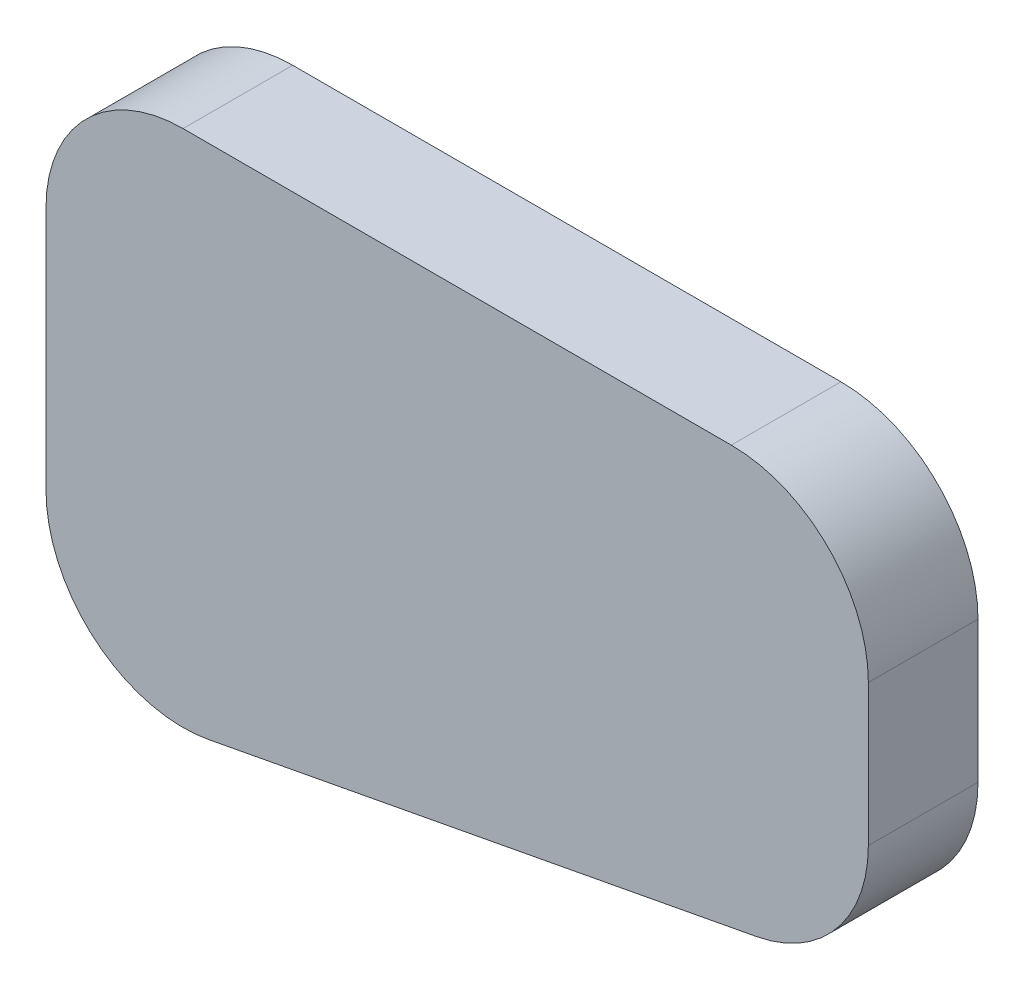
ISO-10303-21;
HEADER;
FILE_DESCRIPTION(('STEP AP214'),'2;1');
FILE_NAME('part.step','',(''),(''),'','','');
FILE_SCHEMA(('AUTOMOTIVE_DESIGN { 1 0 10303 214 1 1 1 1 }'));
ENDSEC;
DATA;
#1=APPLICATION_CONTEXT('core data for automotive mechanical design processes');
#2=APPLICATION_PROTOCOL_DEFINITION('international standard','automotive_design',2000,#1);
#3=PRODUCT_CONTEXT('',#1,'mechanical');
#4=PRODUCT('Part','Part','',(#3));
#5=PRODUCT_RELATED_PRODUCT_CATEGORY('part','',(#4));
#6=PRODUCT_DEFINITION_FORMATION('','',#4);
#7=PRODUCT_DEFINITION_CONTEXT('part definition',#1,'design');
#8=PRODUCT_DEFINITION('design','',#6,#7);
#9=PRODUCT_DEFINITION_SHAPE('','',#8);
#10=(LENGTH_UNIT() NAMED_UNIT(*) SI_UNIT(.MILLI.,.METRE.));
#11=(NAMED_UNIT(*) PLANE_ANGLE_UNIT() SI_UNIT($,.RADIAN.));
#12=(NAMED_UNIT(*) SI_UNIT($,.STERADIAN.) SOLID_ANGLE_UNIT());
#13=UNCERTAINTY_MEASURE_WITH_UNIT(LENGTH_MEASURE(1.E-05),#10,'distance_accuracy_value','');
#14=(GEOMETRIC_REPRESENTATION_CONTEXT(3) GLOBAL_UNCERTAINTY_ASSIGNED_CONTEXT((#13)) GLOBAL_UNIT_ASSIGNED_CONTEXT((#10,
#11,#12)) REPRESENTATION_CONTEXT('',''));
#15=CARTESIAN_POINT('',(0.,0.,0.));
#16=DIRECTION('',(0.,0.,1.));
#17=DIRECTION('',(1.,0.,0.));
#18=AXIS2_PLACEMENT_3D('',#15,#16,#17);
#19=CARTESIAN_POINT('',(88.830582605491,-41.8435666943091,2.54));
#20=DIRECTION('',(0.,0.,-1.));
#21=DIRECTION('',(-1.,0.,0.));
#22=AXIS2_PLACEMENT_3D('',#19,#20,#21);
#23=CYLINDRICAL_SURFACE('',#22,3.17500000000001);
#24=CARTESIAN_POINT('',(88.830582605491,-41.8435666943091,0.));
#25=DIRECTION('',(0.,0.,1.));
#26=DIRECTION('',(1.,0.,0.));
#27=AXIS2_PLACEMENT_3D('',#24,#25,#26);
#28=CIRCLE('',#27,3.17500000000001);
#29=CARTESIAN_POINT('',(89.4190370873672,-44.9635580921755,0.));
#30=VERTEX_POINT('',#29);
#31=CARTESIAN_POINT('',(92.005582605491,-41.8435666943091,0.));
#32=VERTEX_POINT('',#31);
#33=EDGE_CURVE('E129',#30,#32,#28,.T.);
#34=ORIENTED_EDGE('',*,*,#33,.T.);
#35=DIRECTION('',(0.,0.,-1.));
#36=VECTOR('',#35,1.);
#37=CARTESIAN_POINT('',(92.005582605491,-41.8435666943091,2.54));
#38=LINE('',#37,#36);
#39=CARTESIAN_POINT('',(92.005582605491,-41.8435666943091,2.54));
#40=VERTEX_POINT('',#39);
#41=EDGE_CURVE('E11',#40,#32,#38,.T.);
#42=ORIENTED_EDGE('',*,*,#41,.F.);
#43=CARTESIAN_POINT('',(88.830582605491,-41.8435666943091,2.54));
#44=DIRECTION('',(0.,0.,1.));
#45=DIRECTION('',(1.,0.,0.));
#46=AXIS2_PLACEMENT_3D('',#43,#44,#45);
#47=CIRCLE('',#46,3.17500000000001);
#48=CARTESIAN_POINT('',(89.4190370873672,-44.9635580921755,2.54));
#49=VERTEX_POINT('',#48);
#50=EDGE_CURVE('E143',#49,#40,#47,.T.);
#51=ORIENTED_EDGE('',*,*,#50,.F.);
#52=DIRECTION('',(0.,0.,-1.));
#53=VECTOR('',#52,1.);
#54=CARTESIAN_POINT('',(89.4190370873672,-44.9635580921755,2.54));
#55=LINE('',#54,#53);
#56=EDGE_CURVE('E125',#49,#30,#55,.T.);
#57=ORIENTED_EDGE('',*,*,#56,.T.);
#58=EDGE_LOOP('',(#34,#42,#51,#57));
#59=FACE_BOUND('',#58,.T.);
#60=ADVANCED_FACE('F33',(#59),#23,.T.);
#61=CARTESIAN_POINT('',(92.005582605491,-41.8435666943091,2.54));
#62=DIRECTION('',(-1.,0.,0.));
#63=DIRECTION('',(0.,-1.,0.));
#64=AXIS2_PLACEMENT_3D('',#61,#62,#63);
#65=PLANE('',#64);
#66=DIRECTION('',(0.,1.,0.));
#67=VECTOR('',#66,1.);
#68=CARTESIAN_POINT('',(92.005582605491,-41.8435666943091,0.));
#69=LINE('',#68,#67);
#70=CARTESIAN_POINT('',(92.005582605491,-38.5718290335724,0.));
#71=VERTEX_POINT('',#70);
#72=EDGE_CURVE('E132',#32,#71,#69,.T.);
#73=ORIENTED_EDGE('',*,*,#72,.T.);
#74=DIRECTION('',(0.,0.,-1.));
#75=VECTOR('',#74,1.);
#76=CARTESIAN_POINT('',(92.005582605491,-38.5718290335724,2.54));
#77=LINE('',#76,#75);
#78=CARTESIAN_POINT('',(92.005582605491,-38.5718290335724,2.54));
#79=VERTEX_POINT('',#78);
#80=EDGE_CURVE('E41',#79,#71,#77,.T.);
#81=ORIENTED_EDGE('',*,*,#80,.F.);
#82=DIRECTION('',(0.,1.,0.));
#83=VECTOR('',#82,1.);
#84=CARTESIAN_POINT('',(92.005582605491,-41.8435666943091,2.54));
#85=LINE('',#84,#83);
#86=EDGE_CURVE('E92',#40,#79,#85,.T.);
#87=ORIENTED_EDGE('',*,*,#86,.F.);
#88=ORIENTED_EDGE('',*,*,#41,.T.);
#89=EDGE_LOOP('',(#73,#81,#87,#88));
#90=FACE_BOUND('',#89,.T.);
#91=ADVANCED_FACE('F178',(#90),#65,.F.);
#92=CARTESIAN_POINT('',(88.830582605491,-38.5718290335724,2.54));
#93=DIRECTION('',(0.,0.,-1.));
#94=DIRECTION('',(-1.,0.,0.));
#95=AXIS2_PLACEMENT_3D('',#92,#93,#94);
#96=CYLINDRICAL_SURFACE('',#95,3.17500000000002);
#97=CARTESIAN_POINT('',(88.830582605491,-38.5718290335724,0.));
#98=DIRECTION('',(0.,0.,1.));
#99=DIRECTION('',(1.,0.,0.));
#100=AXIS2_PLACEMENT_3D('',#97,#98,#99);
#101=CIRCLE('',#100,3.17500000000002);
#102=CARTESIAN_POINT('',(88.830582605491,-35.3968290335724,0.));
#103=VERTEX_POINT('',#102);
#104=EDGE_CURVE('E134',#71,#103,#101,.T.);
#105=ORIENTED_EDGE('',*,*,#104,.T.);
#106=DIRECTION('',(0.,0.,-1.));
#107=VECTOR('',#106,1.);
#108=CARTESIAN_POINT('',(88.830582605491,-35.3968290335724,2.54));
#109=LINE('',#108,#107);
#110=CARTESIAN_POINT('',(88.830582605491,-35.3968290335724,2.54));
#111=VERTEX_POINT('',#110);
#112=EDGE_CURVE('E150',#111,#103,#109,.T.);
#113=ORIENTED_EDGE('',*,*,#112,.F.);
#114=CARTESIAN_POINT('',(88.830582605491,-38.5718290335724,2.54));
#115=DIRECTION('',(0.,0.,1.));
#116=DIRECTION('',(1.,0.,0.));
#117=AXIS2_PLACEMENT_3D('',#114,#115,#116);
#118=CIRCLE('',#117,3.17500000000002);
#119=EDGE_CURVE('E158',#79,#111,#118,.T.);
#120=ORIENTED_EDGE('',*,*,#119,.F.);
#121=ORIENTED_EDGE('',*,*,#80,.T.);
#122=EDGE_LOOP('',(#105,#113,#120,#121));
#123=FACE_BOUND('',#122,.T.);
#124=ADVANCED_FACE('F156',(#123),#96,.T.);
#125=CARTESIAN_POINT('',(88.830582605491,-35.3968290335724,2.54));
#126=DIRECTION('',(0.,-1.,0.));
#127=DIRECTION('',(1.,0.,0.));
#128=AXIS2_PLACEMENT_3D('',#125,#126,#127);
#129=PLANE('',#128);
#130=DIRECTION('',(-1.,0.,0.));
#131=VECTOR('',#130,1.);
#132=CARTESIAN_POINT('',(88.830582605491,-35.3968290335724,0.));
#133=LINE('',#132,#131);
#134=CARTESIAN_POINT('',(76.130582605491,-35.3968290335724,0.));
#135=VERTEX_POINT('',#134);
#136=EDGE_CURVE('E136',#103,#135,#133,.T.);
#137=ORIENTED_EDGE('',*,*,#136,.T.);
#138=DIRECTION('',(0.,0.,-1.));
#139=VECTOR('',#138,1.);
#140=CARTESIAN_POINT('',(76.130582605491,-35.3968290335724,2.54));
#141=LINE('',#140,#139);
#142=CARTESIAN_POINT('',(76.130582605491,-35.3968290335724,2.54));
#143=VERTEX_POINT('',#142);
#144=EDGE_CURVE('E147',#143,#135,#141,.T.);
#145=ORIENTED_EDGE('',*,*,#144,.F.);
#146=DIRECTION('',(-1.,0.,0.));
#147=VECTOR('',#146,1.);
#148=CARTESIAN_POINT('',(88.830582605491,-35.3968290335724,2.54));
#149=LINE('',#148,#147);
#150=EDGE_CURVE('E170',#111,#143,#149,.T.);
#151=ORIENTED_EDGE('',*,*,#150,.F.);
#152=ORIENTED_EDGE('',*,*,#112,.T.);
#153=EDGE_LOOP('',(#137,#145,#151,#152));
#154=FACE_BOUND('',#153,.T.);
#155=ADVANCED_FACE('F166',(#154),#129,.F.);
#156=CARTESIAN_POINT('',(76.130582605491,-38.5718290335724,2.54));
#157=DIRECTION('',(0.,0.,-1.));
#158=DIRECTION('',(-1.,0.,0.));
#159=AXIS2_PLACEMENT_3D('',#156,#157,#158);
#160=CYLINDRICAL_SURFACE('',#159,3.175);
#161=CARTESIAN_POINT('',(76.130582605491,-38.5718290335724,0.));
#162=DIRECTION('',(0.,0.,1.));
#163=DIRECTION('',(1.,0.,0.));
#164=AXIS2_PLACEMENT_3D('',#161,#162,#163);
#165=CIRCLE('',#164,3.175);
#166=CARTESIAN_POINT('',(72.955582605491,-38.5718290335724,0.));
#167=VERTEX_POINT('',#166);
#168=EDGE_CURVE('E138',#135,#167,#165,.T.);
#169=ORIENTED_EDGE('',*,*,#168,.T.);
#170=DIRECTION('',(0.,0.,-1.));
#171=VECTOR('',#170,1.);
#172=CARTESIAN_POINT('',(72.955582605491,-38.5718290335724,2.54));
#173=LINE('',#172,#171);
#174=CARTESIAN_POINT('',(72.955582605491,-38.5718290335724,2.54));
#175=VERTEX_POINT('',#174);
#176=EDGE_CURVE('E120',#175,#167,#173,.T.);
#177=ORIENTED_EDGE('',*,*,#176,.F.);
#178=CARTESIAN_POINT('',(76.130582605491,-38.5718290335724,2.54));
#179=DIRECTION('',(0.,0.,1.));
#180=DIRECTION('',(1.,0.,0.));
#181=AXIS2_PLACEMENT_3D('',#178,#179,#180);
#182=CIRCLE('',#181,3.175);
#183=EDGE_CURVE('E111',#143,#175,#182,.T.);
#184=ORIENTED_EDGE('',*,*,#183,.F.);
#185=ORIENTED_EDGE('',*,*,#144,.T.);
#186=EDGE_LOOP('',(#169,#177,#184,#185));
#187=FACE_BOUND('',#186,.T.);
#188=ADVANCED_FACE('F169',(#187),#160,.T.);
#189=CARTESIAN_POINT('',(72.955582605491,-38.5718290335724,2.54));
#190=DIRECTION('',(1.,0.,0.));
#191=DIRECTION('',(0.,1.,0.));
#192=AXIS2_PLACEMENT_3D('',#189,#190,#191);
#193=PLANE('',#192);
#194=DIRECTION('',(0.,-1.,0.));
#195=VECTOR('',#194,1.);
#196=CARTESIAN_POINT('',(72.955582605491,-38.5718290335724,0.));
#197=LINE('',#196,#195);
#198=CARTESIAN_POINT('',(72.955582605491,-44.238884811192,0.));
#199=VERTEX_POINT('',#198);
#200=EDGE_CURVE('E119',#167,#199,#197,.T.);
#201=ORIENTED_EDGE('',*,*,#200,.T.);
#202=DIRECTION('',(0.,0.,-1.));
#203=VECTOR('',#202,1.);
#204=CARTESIAN_POINT('',(72.955582605491,-44.238884811192,2.54));
#205=LINE('',#204,#203);
#206=CARTESIAN_POINT('',(72.955582605491,-44.238884811192,2.54));
#207=VERTEX_POINT('',#206);
#208=EDGE_CURVE('E116',#207,#199,#205,.T.);
#209=ORIENTED_EDGE('',*,*,#208,.F.);
#210=DIRECTION('',(0.,-1.,0.));
#211=VECTOR('',#210,1.);
#212=CARTESIAN_POINT('',(72.955582605491,-38.5718290335724,2.54));
#213=LINE('',#212,#211);
#214=EDGE_CURVE('E105',#175,#207,#213,.T.);
#215=ORIENTED_EDGE('',*,*,#214,.F.);
#216=ORIENTED_EDGE('',*,*,#176,.T.);
#217=EDGE_LOOP('',(#201,#209,#215,#216));
#218=FACE_BOUND('',#217,.T.);
#219=ADVANCED_FACE('F117',(#218),#193,.F.);
#220=CARTESIAN_POINT('',(76.130582605491,-44.238884811192,2.54));
#221=DIRECTION('',(0.,0.,-1.));
#222=DIRECTION('',(-1.,0.,0.));
#223=AXIS2_PLACEMENT_3D('',#220,#221,#222);
#224=CYLINDRICAL_SURFACE('',#223,3.17500000000001);
#225=CARTESIAN_POINT('',(76.130582605491,-44.238884811192,0.));
#226=DIRECTION('',(0.,0.,1.));
#227=DIRECTION('',(1.,0.,0.));
#228=AXIS2_PLACEMENT_3D('',#225,#226,#227);
#229=CIRCLE('',#228,3.17500000000001);
#230=CARTESIAN_POINT('',(76.7190370873672,-47.3588762090584,0.));
#231=VERTEX_POINT('',#230);
#232=EDGE_CURVE('E78',#199,#231,#229,.T.);
#233=ORIENTED_EDGE('',*,*,#232,.T.);
#234=DIRECTION('',(0.,0.,-1.));
#235=VECTOR('',#234,1.);
#236=CARTESIAN_POINT('',(76.7190370873672,-47.3588762090584,2.54));
#237=LINE('',#236,#235);
#238=CARTESIAN_POINT('',(76.7190370873672,-47.3588762090584,2.54));
#239=VERTEX_POINT('',#238);
#240=EDGE_CURVE('E121',#239,#231,#237,.T.);
#241=ORIENTED_EDGE('',*,*,#240,.F.);
#242=CARTESIAN_POINT('',(76.130582605491,-44.238884811192,2.54));
#243=DIRECTION('',(0.,0.,1.));
#244=DIRECTION('',(1.,0.,0.));
#245=AXIS2_PLACEMENT_3D('',#242,#243,#244);
#246=CIRCLE('',#245,3.17500000000001);
#247=EDGE_CURVE('E109',#207,#239,#246,.T.);
#248=ORIENTED_EDGE('',*,*,#247,.F.);
#249=ORIENTED_EDGE('',*,*,#208,.T.);
#250=EDGE_LOOP('',(#233,#241,#248,#249));
#251=FACE_BOUND('',#250,.T.);
#252=ADVANCED_FACE('F123',(#251),#224,.T.);
#253=CARTESIAN_POINT('',(76.7190370873672,-47.3588762090584,2.54));
#254=DIRECTION('',(-0.185339994291723,0.982674456020886,0.));
#255=DIRECTION('',(-0.982674456020886,-0.185339994291723,0.));
#256=AXIS2_PLACEMENT_3D('',#253,#254,#255);
#257=PLANE('',#256);
#258=DIRECTION('',(0.982674456020886,0.185339994291723,0.));
#259=VECTOR('',#258,1.);
#260=CARTESIAN_POINT('',(76.7190370873672,-47.3588762090584,0.));
#261=LINE('',#260,#259);
#262=EDGE_CURVE('E84',#231,#30,#261,.T.);
#263=ORIENTED_EDGE('',*,*,#262,.T.);
#264=ORIENTED_EDGE('',*,*,#56,.F.);
#265=DIRECTION('',(0.982674456020886,0.185339994291723,0.));
#266=VECTOR('',#265,1.);
#267=CARTESIAN_POINT('',(76.7190370873672,-47.3588762090584,2.54));
#268=LINE('',#267,#266);
#269=EDGE_CURVE('E49',#239,#49,#268,.T.);
#270=ORIENTED_EDGE('',*,*,#269,.F.);
#271=ORIENTED_EDGE('',*,*,#240,.T.);
#272=EDGE_LOOP('',(#263,#264,#270,#271));
#273=FACE_BOUND('',#272,.T.);
#274=ADVANCED_FACE('F194',(#273),#257,.F.);
#275=CARTESIAN_POINT('',(88.830582605491,-41.8435666943091,2.54));
#276=DIRECTION('',(0.,0.,1.));
#277=DIRECTION('',(1.,0.,0.));
#278=AXIS2_PLACEMENT_3D('',#275,#276,#277);
#279=PLANE('',#278);
#280=ORIENTED_EDGE('',*,*,#50,.T.);
#281=ORIENTED_EDGE('',*,*,#86,.T.);
#282=ORIENTED_EDGE('',*,*,#119,.T.);
#283=ORIENTED_EDGE('',*,*,#150,.T.);
#284=ORIENTED_EDGE('',*,*,#183,.T.);
#285=ORIENTED_EDGE('',*,*,#214,.T.);
#286=ORIENTED_EDGE('',*,*,#247,.T.);
#287=ORIENTED_EDGE('',*,*,#269,.T.);
#288=EDGE_LOOP('',(#280,#281,#282,#283,#284,#285,#286,#287));
#289=FACE_BOUND('',#288,.T.);
#290=ADVANCED_FACE('F107',(#289),#279,.T.);
#291=CARTESIAN_POINT('',(88.830582605491,-41.8435666943091,0.));
#292=DIRECTION('',(0.,0.,1.));
#293=DIRECTION('',(1.,0.,0.));
#294=AXIS2_PLACEMENT_3D('',#291,#292,#293);
#295=PLANE('',#294);
#296=ORIENTED_EDGE('',*,*,#33,.F.);
#297=ORIENTED_EDGE('',*,*,#262,.F.);
#298=ORIENTED_EDGE('',*,*,#232,.F.);
#299=ORIENTED_EDGE('',*,*,#200,.F.);
#300=ORIENTED_EDGE('',*,*,#168,.F.);
#301=ORIENTED_EDGE('',*,*,#136,.F.);
#302=ORIENTED_EDGE('',*,*,#104,.F.);
#303=ORIENTED_EDGE('',*,*,#72,.F.);
#304=EDGE_LOOP('',(#296,#297,#298,#299,#300,#301,#302,#303));
#305=FACE_BOUND('',#304,.T.);
#306=ADVANCED_FACE('F162',(#305),#295,.F.);
#307=CLOSED_SHELL('',(#60,#91,#124,#155,#188,#219,#252,#274,#290,#306));
#308=MANIFOLD_SOLID_BREP('B2',#307);
#309=ADVANCED_BREP_SHAPE_REPRESENTATION('',(#18,#308),#14);
#310=SHAPE_DEFINITION_REPRESENTATION(#9,#309);
ENDSEC;
END-ISO-10303-21;
